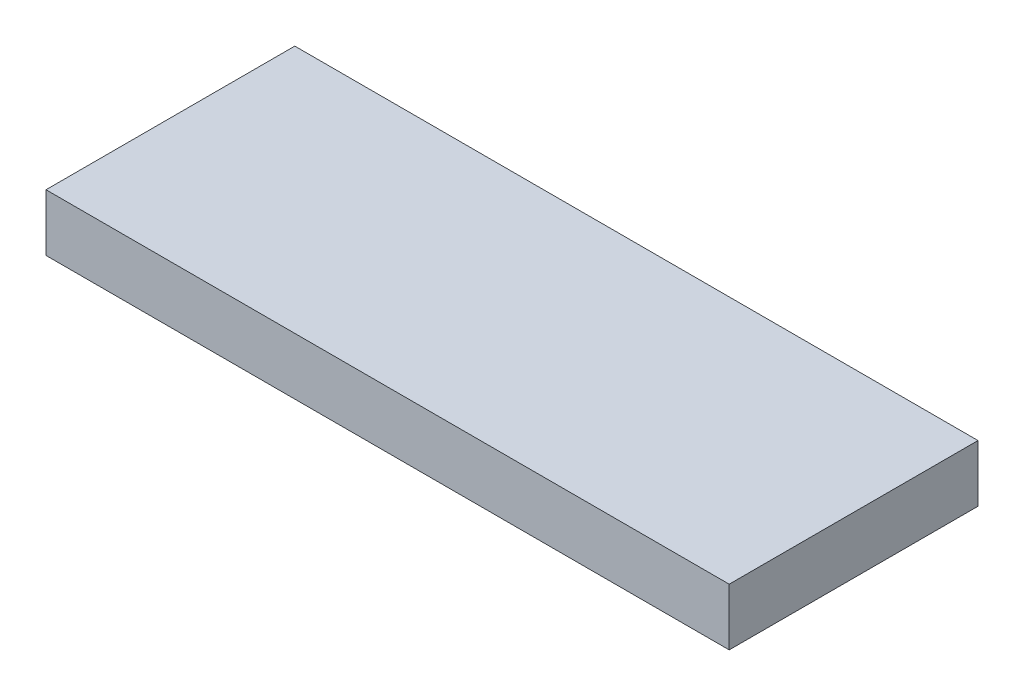
ISO-10303-21;
HEADER;
FILE_DESCRIPTION(('STEP AP214'),'2;1');
FILE_NAME('part.step','',(''),(''),'','','');
FILE_SCHEMA(('AUTOMOTIVE_DESIGN { 1 0 10303 214 1 1 1 1 }'));
ENDSEC;
DATA;
#1=APPLICATION_CONTEXT('core data for automotive mechanical design processes');
#2=APPLICATION_PROTOCOL_DEFINITION('international standard','automotive_design',2000,#1);
#3=PRODUCT_CONTEXT('',#1,'mechanical');
#4=PRODUCT('Part','Part','',(#3));
#5=PRODUCT_RELATED_PRODUCT_CATEGORY('part','',(#4));
#6=PRODUCT_DEFINITION_FORMATION('','',#4);
#7=PRODUCT_DEFINITION_CONTEXT('part definition',#1,'design');
#8=PRODUCT_DEFINITION('design','',#6,#7);
#9=PRODUCT_DEFINITION_SHAPE('','',#8);
#10=(LENGTH_UNIT() NAMED_UNIT(*) SI_UNIT(.MILLI.,.METRE.));
#11=(NAMED_UNIT(*) PLANE_ANGLE_UNIT() SI_UNIT($,.RADIAN.));
#12=(NAMED_UNIT(*) SI_UNIT($,.STERADIAN.) SOLID_ANGLE_UNIT());
#13=UNCERTAINTY_MEASURE_WITH_UNIT(LENGTH_MEASURE(1.E-05),#10,'distance_accuracy_value','');
#14=(GEOMETRIC_REPRESENTATION_CONTEXT(3) GLOBAL_UNCERTAINTY_ASSIGNED_CONTEXT((#13)) GLOBAL_UNIT_ASSIGNED_CONTEXT((#10,
#11,#12)) REPRESENTATION_CONTEXT('',''));
#15=CARTESIAN_POINT('',(0.,0.,0.));
#16=DIRECTION('',(0.,0.,1.));
#17=DIRECTION('',(1.,0.,0.));
#18=AXIS2_PLACEMENT_3D('',#15,#16,#17);
#19=CARTESIAN_POINT('',(-15.24,-1.27,0.));
#20=DIRECTION('',(0.,1.,0.));
#21=DIRECTION('',(0.,0.,1.));
#22=AXIS2_PLACEMENT_3D('',#19,#20,#21);
#23=PLANE('',#22);
#24=DIRECTION('',(0.,0.,1.));
#25=VECTOR('',#24,1.);
#26=CARTESIAN_POINT('',(15.24,-1.27,0.));
#27=LINE('',#26,#25);
#28=CARTESIAN_POINT('',(15.24,-1.27,0.));
#29=VERTEX_POINT('',#28);
#30=CARTESIAN_POINT('',(15.24,-1.27,11.10000066));
#31=VERTEX_POINT('',#30);
#32=EDGE_CURVE('E20',#29,#31,#27,.T.);
#33=ORIENTED_EDGE('',*,*,#32,.T.);
#34=DIRECTION('',(-1.,0.,0.));
#35=VECTOR('',#34,1.);
#36=CARTESIAN_POINT('',(15.24,-1.27,11.10000066));
#37=LINE('',#36,#35);
#38=CARTESIAN_POINT('',(-15.24,-1.27,11.10000066));
#39=VERTEX_POINT('',#38);
#40=EDGE_CURVE('E55',#31,#39,#37,.T.);
#41=ORIENTED_EDGE('',*,*,#40,.T.);
#42=DIRECTION('',(0.,0.,-1.));
#43=VECTOR('',#42,1.);
#44=CARTESIAN_POINT('',(-15.24,-1.27,0.));
#45=LINE('',#44,#43);
#46=CARTESIAN_POINT('',(-15.24,-1.27,0.));
#47=VERTEX_POINT('',#46);
#48=EDGE_CURVE('E74',#39,#47,#45,.T.);
#49=ORIENTED_EDGE('',*,*,#48,.T.);
#50=DIRECTION('',(-1.,0.,0.));
#51=VECTOR('',#50,1.);
#52=CARTESIAN_POINT('',(15.24,-1.27,0.));
#53=LINE('',#52,#51);
#54=EDGE_CURVE('E66',#29,#47,#53,.T.);
#55=ORIENTED_EDGE('',*,*,#54,.F.);
#56=EDGE_LOOP('',(#33,#41,#49,#55));
#57=FACE_BOUND('',#56,.T.);
#58=ADVANCED_FACE('F17',(#57),#23,.F.);
#59=CARTESIAN_POINT('',(15.24,-1.27,0.));
#60=DIRECTION('',(-1.,0.,0.));
#61=DIRECTION('',(0.,0.,1.));
#62=AXIS2_PLACEMENT_3D('',#59,#60,#61);
#63=PLANE('',#62);
#64=DIRECTION('',(0.,0.,-1.));
#65=VECTOR('',#64,1.);
#66=CARTESIAN_POINT('',(15.24,1.27,0.));
#67=LINE('',#66,#65);
#68=CARTESIAN_POINT('',(15.24,1.27,0.));
#69=VERTEX_POINT('',#68);
#70=CARTESIAN_POINT('',(15.24,1.27,11.10000066));
#71=VERTEX_POINT('',#70);
#72=EDGE_CURVE('E72',#69,#71,#67,.F.);
#73=ORIENTED_EDGE('',*,*,#72,.T.);
#74=DIRECTION('',(0.,1.,0.));
#75=VECTOR('',#74,1.);
#76=CARTESIAN_POINT('',(15.24,-1.27,11.10000066));
#77=LINE('',#76,#75);
#78=EDGE_CURVE('E62',#71,#31,#77,.F.);
#79=ORIENTED_EDGE('',*,*,#78,.T.);
#80=ORIENTED_EDGE('',*,*,#32,.F.);
#81=DIRECTION('',(0.,1.,0.));
#82=VECTOR('',#81,1.);
#83=CARTESIAN_POINT('',(15.24,-1.27,0.));
#84=LINE('',#83,#82);
#85=EDGE_CURVE('E80',#69,#29,#84,.F.);
#86=ORIENTED_EDGE('',*,*,#85,.F.);
#87=EDGE_LOOP('',(#73,#79,#80,#86));
#88=FACE_BOUND('',#87,.T.);
#89=ADVANCED_FACE('F71',(#88),#63,.F.);
#90=CARTESIAN_POINT('',(15.24,-1.27,11.10000066));
#91=DIRECTION('',(0.,0.,-1.));
#92=DIRECTION('',(-1.,0.,0.));
#93=AXIS2_PLACEMENT_3D('',#90,#91,#92);
#94=PLANE('',#93);
#95=DIRECTION('',(1.,0.,0.));
#96=VECTOR('',#95,1.);
#97=CARTESIAN_POINT('',(15.24,1.27,11.10000066));
#98=LINE('',#97,#96);
#99=CARTESIAN_POINT('',(-15.24,1.27,11.10000066));
#100=VERTEX_POINT('',#99);
#101=EDGE_CURVE('E83',#71,#100,#98,.F.);
#102=ORIENTED_EDGE('',*,*,#101,.T.);
#103=DIRECTION('',(0.,1.,0.));
#104=VECTOR('',#103,1.);
#105=CARTESIAN_POINT('',(-15.24,1.27,11.10000066));
#106=LINE('',#105,#104);
#107=EDGE_CURVE('E64',#100,#39,#106,.F.);
#108=ORIENTED_EDGE('',*,*,#107,.T.);
#109=ORIENTED_EDGE('',*,*,#40,.F.);
#110=ORIENTED_EDGE('',*,*,#78,.F.);
#111=EDGE_LOOP('',(#102,#108,#109,#110));
#112=FACE_BOUND('',#111,.T.);
#113=ADVANCED_FACE('F60',(#112),#94,.F.);
#114=CARTESIAN_POINT('',(-15.24,1.27,0.));
#115=DIRECTION('',(1.,0.,0.));
#116=DIRECTION('',(0.,0.,-1.));
#117=AXIS2_PLACEMENT_3D('',#114,#115,#116);
#118=PLANE('',#117);
#119=ORIENTED_EDGE('',*,*,#48,.F.);
#120=ORIENTED_EDGE('',*,*,#107,.F.);
#121=DIRECTION('',(0.,0.,-1.));
#122=VECTOR('',#121,1.);
#123=CARTESIAN_POINT('',(-15.24,1.27,0.));
#124=LINE('',#123,#122);
#125=CARTESIAN_POINT('',(-15.24,1.27,0.));
#126=VERTEX_POINT('',#125);
#127=EDGE_CURVE('E26',#100,#126,#124,.T.);
#128=ORIENTED_EDGE('',*,*,#127,.T.);
#129=DIRECTION('',(0.,1.,0.));
#130=VECTOR('',#129,1.);
#131=CARTESIAN_POINT('',(-15.24,-1.27,0.));
#132=LINE('',#131,#130);
#133=EDGE_CURVE('E34',#47,#126,#132,.T.);
#134=ORIENTED_EDGE('',*,*,#133,.F.);
#135=EDGE_LOOP('',(#119,#120,#128,#134));
#136=FACE_BOUND('',#135,.T.);
#137=ADVANCED_FACE('F88',(#136),#118,.F.);
#138=CARTESIAN_POINT('',(15.24,-1.27,0.));
#139=DIRECTION('',(0.,0.,-1.));
#140=DIRECTION('',(-1.,0.,0.));
#141=AXIS2_PLACEMENT_3D('',#138,#139,#140);
#142=PLANE('',#141);
#143=DIRECTION('',(1.,0.,0.));
#144=VECTOR('',#143,1.);
#145=CARTESIAN_POINT('',(15.24,1.27,0.));
#146=LINE('',#145,#144);
#147=EDGE_CURVE('E11',#126,#69,#146,.T.);
#148=ORIENTED_EDGE('',*,*,#147,.T.);
#149=ORIENTED_EDGE('',*,*,#85,.T.);
#150=ORIENTED_EDGE('',*,*,#54,.T.);
#151=ORIENTED_EDGE('',*,*,#133,.T.);
#152=EDGE_LOOP('',(#148,#149,#150,#151));
#153=FACE_BOUND('',#152,.T.);
#154=ADVANCED_FACE('F91',(#153),#142,.T.);
#155=CARTESIAN_POINT('',(15.24,1.27,0.));
#156=DIRECTION('',(0.,-1.,0.));
#157=DIRECTION('',(0.,0.,-1.));
#158=AXIS2_PLACEMENT_3D('',#155,#156,#157);
#159=PLANE('',#158);
#160=ORIENTED_EDGE('',*,*,#127,.F.);
#161=ORIENTED_EDGE('',*,*,#101,.F.);
#162=ORIENTED_EDGE('',*,*,#72,.F.);
#163=ORIENTED_EDGE('',*,*,#147,.F.);
#164=EDGE_LOOP('',(#160,#161,#162,#163));
#165=FACE_BOUND('',#164,.T.);
#166=ADVANCED_FACE('F90',(#165),#159,.F.);
#167=CLOSED_SHELL('',(#58,#89,#113,#137,#154,#166));
#168=MANIFOLD_SOLID_BREP('B1',#167);
#169=ADVANCED_BREP_SHAPE_REPRESENTATION('',(#18,#168),#14);
#170=SHAPE_DEFINITION_REPRESENTATION(#9,#169);
ENDSEC;
END-ISO-10303-21;
